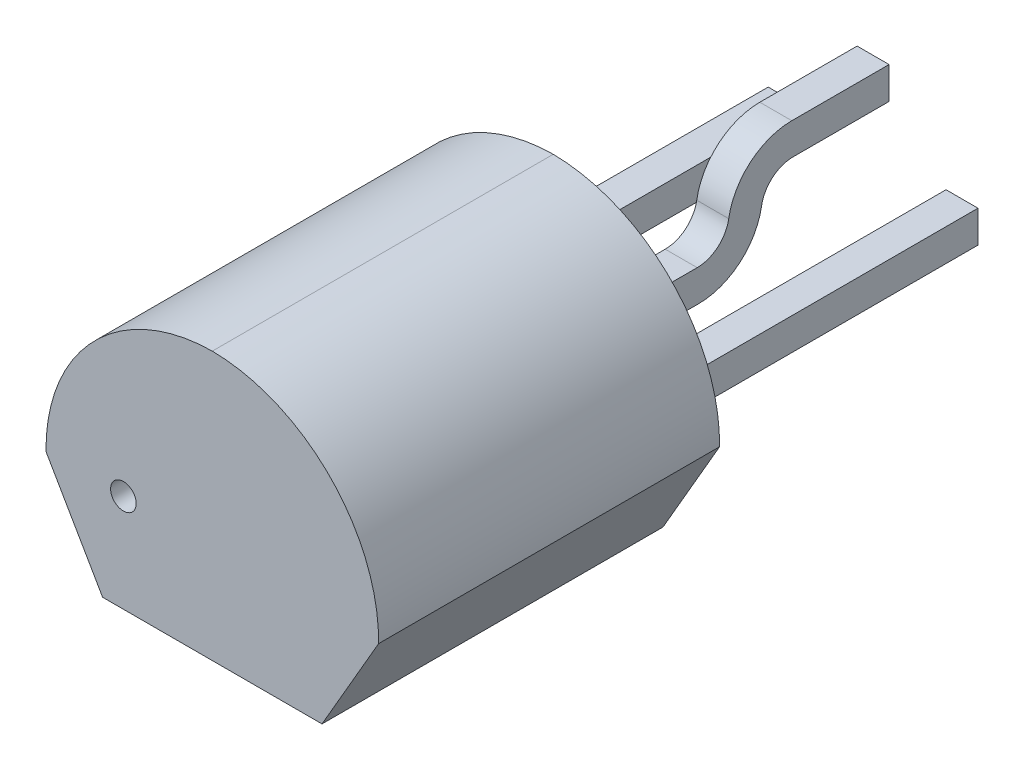
ISO-10303-21;
HEADER;
FILE_DESCRIPTION(('STEP AP214'),'2;1');
FILE_NAME('part.step','',(''),(''),'','','');
FILE_SCHEMA(('AUTOMOTIVE_DESIGN { 1 0 10303 214 1 1 1 1 }'));
ENDSEC;
DATA;
#1=APPLICATION_CONTEXT('core data for automotive mechanical design processes');
#2=APPLICATION_PROTOCOL_DEFINITION('international standard','automotive_design',2000,#1);
#3=PRODUCT_CONTEXT('',#1,'mechanical');
#4=PRODUCT('Part','Part','',(#3));
#5=PRODUCT_RELATED_PRODUCT_CATEGORY('part','',(#4));
#6=PRODUCT_DEFINITION_FORMATION('','',#4);
#7=PRODUCT_DEFINITION_CONTEXT('part definition',#1,'design');
#8=PRODUCT_DEFINITION('design','',#6,#7);
#9=PRODUCT_DEFINITION_SHAPE('','',#8);
#10=(LENGTH_UNIT() NAMED_UNIT(*) SI_UNIT(.MILLI.,.METRE.));
#11=(NAMED_UNIT(*) PLANE_ANGLE_UNIT() SI_UNIT($,.RADIAN.));
#12=(NAMED_UNIT(*) SI_UNIT($,.STERADIAN.) SOLID_ANGLE_UNIT());
#13=UNCERTAINTY_MEASURE_WITH_UNIT(LENGTH_MEASURE(1.E-05),#10,'distance_accuracy_value','');
#14=(GEOMETRIC_REPRESENTATION_CONTEXT(3) GLOBAL_UNCERTAINTY_ASSIGNED_CONTEXT((#13)) GLOBAL_UNIT_ASSIGNED_CONTEXT((#10,
#11,#12)) REPRESENTATION_CONTEXT('',''));
#15=CARTESIAN_POINT('',(0.,0.,0.));
#16=DIRECTION('',(0.,0.,1.));
#17=DIRECTION('',(1.,0.,0.));
#18=AXIS2_PLACEMENT_3D('',#15,#16,#17);
#19=CARTESIAN_POINT('',(1.14,0.25,2.54));
#20=DIRECTION('',(1.,0.,0.));
#21=DIRECTION('',(0.,0.,-1.));
#22=AXIS2_PLACEMENT_3D('',#19,#20,#21);
#23=PLANE('',#22);
#24=CARTESIAN_POINT('',(1.14,0.5,-0.96));
#25=DIRECTION('',(1.,0.,0.));
#26=DIRECTION('',(0.,0.,-1.));
#27=AXIS2_PLACEMENT_3D('',#24,#25,#26);
#28=CIRCLE('',#27,0.5);
#29=CARTESIAN_POINT('',(1.14,0.583333333333334,-0.466993351408365));
#30=VERTEX_POINT('',#29);
#31=CARTESIAN_POINT('',(1.14,1.,-0.960000000000003));
#32=VERTEX_POINT('',#31);
#33=EDGE_CURVE('E238',#30,#32,#28,.F.);
#34=ORIENTED_EDGE('',*,*,#33,.F.);
#35=CARTESIAN_POINT('',(1.14,0.750000000000001,0.519019945774904));
#36=DIRECTION('',(1.,0.,0.));
#37=DIRECTION('',(0.,0.,-1.));
#38=AXIS2_PLACEMENT_3D('',#35,#36,#37);
#39=CIRCLE('',#38,1.);
#40=CARTESIAN_POINT('',(1.14,-0.25,0.519019945774904));
#41=VERTEX_POINT('',#40);
#42=EDGE_CURVE('E52',#30,#41,#39,.F.);
#43=ORIENTED_EDGE('',*,*,#42,.T.);
#44=DIRECTION('',(0.,0.,-1.));
#45=VECTOR('',#44,1.);
#46=CARTESIAN_POINT('',(1.14,-0.25,2.54));
#47=LINE('',#46,#45);
#48=CARTESIAN_POINT('',(1.14,-0.25,2.54));
#49=VERTEX_POINT('',#48);
#50=EDGE_CURVE('E303',#49,#41,#47,.T.);
#51=ORIENTED_EDGE('',*,*,#50,.F.);
#52=DIRECTION('',(0.,-1.,0.));
#53=VECTOR('',#52,1.);
#54=CARTESIAN_POINT('',(1.14,0.25,2.54));
#55=LINE('',#54,#53);
#56=CARTESIAN_POINT('',(1.14,0.25,2.54));
#57=VERTEX_POINT('',#56);
#58=EDGE_CURVE('E283',#57,#49,#55,.T.);
#59=ORIENTED_EDGE('',*,*,#58,.F.);
#60=DIRECTION('',(0.,0.,-1.));
#61=VECTOR('',#60,1.);
#62=CARTESIAN_POINT('',(1.14,0.25,2.54));
#63=LINE('',#62,#61);
#64=CARTESIAN_POINT('',(1.14,0.25,0.54));
#65=VERTEX_POINT('',#64);
#66=EDGE_CURVE('E295',#57,#65,#63,.T.);
#67=ORIENTED_EDGE('',*,*,#66,.T.);
#68=CARTESIAN_POINT('',(1.14,0.75,0.54));
#69=DIRECTION('',(1.,0.,0.));
#70=DIRECTION('',(0.,0.,-1.));
#71=AXIS2_PLACEMENT_3D('',#68,#69,#70);
#72=CIRCLE('',#71,0.5);
#73=CARTESIAN_POINT('',(1.14,0.666666666666667,0.0469933514083655));
#74=VERTEX_POINT('',#73);
#75=EDGE_CURVE('E220',#65,#74,#72,.T.);
#76=ORIENTED_EDGE('',*,*,#75,.T.);
#77=CARTESIAN_POINT('',(1.14,0.5,-0.939019945774904));
#78=DIRECTION('',(1.,0.,0.));
#79=DIRECTION('',(0.,0.,-1.));
#80=AXIS2_PLACEMENT_3D('',#77,#78,#79);
#81=CIRCLE('',#80,1.);
#82=CARTESIAN_POINT('',(1.14,1.5,-0.939019945774904));
#83=VERTEX_POINT('',#82);
#84=EDGE_CURVE('E230',#74,#83,#81,.F.);
#85=ORIENTED_EDGE('',*,*,#84,.T.);
#86=DIRECTION('',(0.,0.,1.));
#87=VECTOR('',#86,1.);
#88=CARTESIAN_POINT('',(1.14,1.5,-10.16));
#89=LINE('',#88,#87);
#90=CARTESIAN_POINT('',(1.14,1.5,-2.46));
#91=VERTEX_POINT('',#90);
#92=EDGE_CURVE('E243',#91,#83,#89,.T.);
#93=ORIENTED_EDGE('',*,*,#92,.F.);
#94=DIRECTION('',(0.,1.,0.));
#95=VECTOR('',#94,1.);
#96=CARTESIAN_POINT('',(1.14,0.25,-2.46));
#97=LINE('',#96,#95);
#98=CARTESIAN_POINT('',(1.14,1.,-2.46));
#99=VERTEX_POINT('',#98);
#100=EDGE_CURVE('E195',#99,#91,#97,.T.);
#101=ORIENTED_EDGE('',*,*,#100,.F.);
#102=DIRECTION('',(0.,0.,-1.));
#103=VECTOR('',#102,1.);
#104=CARTESIAN_POINT('',(1.14,1.,2.54));
#105=LINE('',#104,#103);
#106=EDGE_CURVE('E204',#32,#99,#105,.T.);
#107=ORIENTED_EDGE('',*,*,#106,.F.);
#108=EDGE_LOOP('',(#34,#43,#51,#59,#67,#76,#85,#93,#101,#107));
#109=FACE_BOUND('',#108,.T.);
#110=ADVANCED_FACE('F30',(#109),#23,.F.);
#111=CARTESIAN_POINT('',(1.14,-0.25,2.54));
#112=DIRECTION('',(0.,1.,0.));
#113=DIRECTION('',(-1.,0.,0.));
#114=AXIS2_PLACEMENT_3D('',#111,#112,#113);
#115=PLANE('',#114);
#116=ORIENTED_EDGE('',*,*,#50,.T.);
#117=DIRECTION('',(1.,0.,0.));
#118=VECTOR('',#117,1.);
#119=CARTESIAN_POINT('',(1.64,-0.25,0.519019945774904));
#120=LINE('',#119,#118);
#121=CARTESIAN_POINT('',(1.64,-0.25,0.519019945774904));
#122=VERTEX_POINT('',#121);
#123=EDGE_CURVE('E38',#41,#122,#120,.T.);
#124=ORIENTED_EDGE('',*,*,#123,.T.);
#125=DIRECTION('',(0.,0.,-1.));
#126=VECTOR('',#125,1.);
#127=CARTESIAN_POINT('',(1.64,-0.25,2.54));
#128=LINE('',#127,#126);
#129=CARTESIAN_POINT('',(1.64,-0.25,2.54));
#130=VERTEX_POINT('',#129);
#131=EDGE_CURVE('E301',#130,#122,#128,.T.);
#132=ORIENTED_EDGE('',*,*,#131,.F.);
#133=DIRECTION('',(1.,0.,0.));
#134=VECTOR('',#133,1.);
#135=CARTESIAN_POINT('',(1.14,-0.25,2.54));
#136=LINE('',#135,#134);
#137=EDGE_CURVE('E286',#49,#130,#136,.T.);
#138=ORIENTED_EDGE('',*,*,#137,.F.);
#139=EDGE_LOOP('',(#116,#124,#132,#138));
#140=FACE_BOUND('',#139,.T.);
#141=ADVANCED_FACE('F391',(#140),#115,.F.);
#142=CARTESIAN_POINT('',(1.64,0.25,2.54));
#143=DIRECTION('',(-1.,0.,0.));
#144=DIRECTION('',(0.,0.,1.));
#145=AXIS2_PLACEMENT_3D('',#142,#143,#144);
#146=PLANE('',#145);
#147=ORIENTED_EDGE('',*,*,#131,.T.);
#148=CARTESIAN_POINT('',(1.64,0.750000000000001,0.519019945774904));
#149=DIRECTION('',(-1.,0.,0.));
#150=DIRECTION('',(0.,0.,1.));
#151=AXIS2_PLACEMENT_3D('',#148,#149,#150);
#152=CIRCLE('',#151,1.);
#153=CARTESIAN_POINT('',(1.64,0.583333333333334,-0.466993351408365));
#154=VERTEX_POINT('',#153);
#155=EDGE_CURVE('E11',#122,#154,#152,.F.);
#156=ORIENTED_EDGE('',*,*,#155,.T.);
#157=CARTESIAN_POINT('',(1.64,0.5,-0.96));
#158=DIRECTION('',(-1.,0.,0.));
#159=DIRECTION('',(0.,0.,1.));
#160=AXIS2_PLACEMENT_3D('',#157,#158,#159);
#161=CIRCLE('',#160,0.5);
#162=CARTESIAN_POINT('',(1.64,1.,-0.960000000000003));
#163=VERTEX_POINT('',#162);
#164=EDGE_CURVE('E209',#163,#154,#161,.F.);
#165=ORIENTED_EDGE('',*,*,#164,.F.);
#166=DIRECTION('',(0.,0.,1.));
#167=VECTOR('',#166,1.);
#168=CARTESIAN_POINT('',(1.64,1.,2.54));
#169=LINE('',#168,#167);
#170=CARTESIAN_POINT('',(1.64,1.,-2.46));
#171=VERTEX_POINT('',#170);
#172=EDGE_CURVE('E201',#171,#163,#169,.T.);
#173=ORIENTED_EDGE('',*,*,#172,.F.);
#174=DIRECTION('',(0.,-1.,0.));
#175=VECTOR('',#174,1.);
#176=CARTESIAN_POINT('',(1.64,0.25,-2.46));
#177=LINE('',#176,#175);
#178=CARTESIAN_POINT('',(1.64,1.5,-2.46));
#179=VERTEX_POINT('',#178);
#180=EDGE_CURVE('E185',#179,#171,#177,.T.);
#181=ORIENTED_EDGE('',*,*,#180,.F.);
#182=DIRECTION('',(0.,0.,-1.));
#183=VECTOR('',#182,1.);
#184=CARTESIAN_POINT('',(1.64,1.5,0.0400000000000001));
#185=LINE('',#184,#183);
#186=CARTESIAN_POINT('',(1.64,1.5,-0.939019945774904));
#187=VERTEX_POINT('',#186);
#188=EDGE_CURVE('E251',#187,#179,#185,.T.);
#189=ORIENTED_EDGE('',*,*,#188,.F.);
#190=CARTESIAN_POINT('',(1.64,0.5,-0.939019945774904));
#191=DIRECTION('',(-1.,0.,0.));
#192=DIRECTION('',(0.,0.,1.));
#193=AXIS2_PLACEMENT_3D('',#190,#191,#192);
#194=CIRCLE('',#193,1.);
#195=CARTESIAN_POINT('',(1.64,0.666666666666667,0.0469933514083655));
#196=VERTEX_POINT('',#195);
#197=EDGE_CURVE('E226',#187,#196,#194,.F.);
#198=ORIENTED_EDGE('',*,*,#197,.T.);
#199=CARTESIAN_POINT('',(1.64,0.75,0.54));
#200=DIRECTION('',(-1.,0.,0.));
#201=DIRECTION('',(0.,0.,1.));
#202=AXIS2_PLACEMENT_3D('',#199,#200,#201);
#203=CIRCLE('',#202,0.5);
#204=CARTESIAN_POINT('',(1.64,0.25,0.54));
#205=VERTEX_POINT('',#204);
#206=EDGE_CURVE('E218',#196,#205,#203,.T.);
#207=ORIENTED_EDGE('',*,*,#206,.T.);
#208=DIRECTION('',(0.,0.,-1.));
#209=VECTOR('',#208,1.);
#210=CARTESIAN_POINT('',(1.64,0.25,2.54));
#211=LINE('',#210,#209);
#212=CARTESIAN_POINT('',(1.64,0.25,2.54));
#213=VERTEX_POINT('',#212);
#214=EDGE_CURVE('E298',#213,#205,#211,.T.);
#215=ORIENTED_EDGE('',*,*,#214,.F.);
#216=DIRECTION('',(0.,1.,0.));
#217=VECTOR('',#216,1.);
#218=CARTESIAN_POINT('',(1.64,0.25,2.54));
#219=LINE('',#218,#217);
#220=EDGE_CURVE('E289',#130,#213,#219,.T.);
#221=ORIENTED_EDGE('',*,*,#220,.F.);
#222=EDGE_LOOP('',(#147,#156,#165,#173,#181,#189,#198,#207,#215,#221));
#223=FACE_BOUND('',#222,.T.);
#224=ADVANCED_FACE('F207',(#223),#146,.F.);
#225=CARTESIAN_POINT('',(-0.25,0.25,2.54));
#226=DIRECTION('',(1.,0.,0.));
#227=DIRECTION('',(0.,1.,0.));
#228=AXIS2_PLACEMENT_3D('',#225,#226,#227);
#229=PLANE('',#228);
#230=DIRECTION('',(0.,1.,0.));
#231=VECTOR('',#230,1.);
#232=CARTESIAN_POINT('',(-0.25,0.25,-2.46));
#233=LINE('',#232,#231);
#234=CARTESIAN_POINT('',(-0.25,-0.25,-2.46));
#235=VERTEX_POINT('',#234);
#236=CARTESIAN_POINT('',(-0.25,0.25,-2.46));
#237=VERTEX_POINT('',#236);
#238=EDGE_CURVE('E241',#235,#237,#233,.T.);
#239=ORIENTED_EDGE('',*,*,#238,.F.);
#240=DIRECTION('',(0.,0.,-1.));
#241=VECTOR('',#240,1.);
#242=CARTESIAN_POINT('',(-0.25,-0.25,2.54));
#243=LINE('',#242,#241);
#244=CARTESIAN_POINT('',(-0.25,-0.25,2.54));
#245=VERTEX_POINT('',#244);
#246=EDGE_CURVE('E326',#245,#235,#243,.T.);
#247=ORIENTED_EDGE('',*,*,#246,.F.);
#248=DIRECTION('',(0.,-1.,0.));
#249=VECTOR('',#248,1.);
#250=CARTESIAN_POINT('',(-0.25,0.25,2.54));
#251=LINE('',#250,#249);
#252=CARTESIAN_POINT('',(-0.25,0.25,2.54));
#253=VERTEX_POINT('',#252);
#254=EDGE_CURVE('E305',#253,#245,#251,.T.);
#255=ORIENTED_EDGE('',*,*,#254,.F.);
#256=DIRECTION('',(0.,0.,-1.));
#257=VECTOR('',#256,1.);
#258=CARTESIAN_POINT('',(-0.25,0.25,2.54));
#259=LINE('',#258,#257);
#260=EDGE_CURVE('E317',#253,#237,#259,.T.);
#261=ORIENTED_EDGE('',*,*,#260,.T.);
#262=EDGE_LOOP('',(#239,#247,#255,#261));
#263=FACE_BOUND('',#262,.T.);
#264=ADVANCED_FACE('F411',(#263),#229,.F.);
#265=CARTESIAN_POINT('',(-0.25,-0.25,2.54));
#266=DIRECTION('',(0.,1.,0.));
#267=DIRECTION('',(0.,0.,1.));
#268=AXIS2_PLACEMENT_3D('',#265,#266,#267);
#269=PLANE('',#268);
#270=DIRECTION('',(-1.,0.,0.));
#271=VECTOR('',#270,1.);
#272=CARTESIAN_POINT('',(-0.25,-0.25,-2.46));
#273=LINE('',#272,#271);
#274=CARTESIAN_POINT('',(0.25,-0.25,-2.46));
#275=VERTEX_POINT('',#274);
#276=EDGE_CURVE('E245',#275,#235,#273,.T.);
#277=ORIENTED_EDGE('',*,*,#276,.F.);
#278=DIRECTION('',(0.,0.,-1.));
#279=VECTOR('',#278,1.);
#280=CARTESIAN_POINT('',(0.25,-0.25,2.54));
#281=LINE('',#280,#279);
#282=CARTESIAN_POINT('',(0.25,-0.25,2.54));
#283=VERTEX_POINT('',#282);
#284=EDGE_CURVE('E323',#283,#275,#281,.T.);
#285=ORIENTED_EDGE('',*,*,#284,.F.);
#286=DIRECTION('',(1.,0.,0.));
#287=VECTOR('',#286,1.);
#288=CARTESIAN_POINT('',(-0.25,-0.25,2.54));
#289=LINE('',#288,#287);
#290=EDGE_CURVE('E308',#245,#283,#289,.T.);
#291=ORIENTED_EDGE('',*,*,#290,.F.);
#292=ORIENTED_EDGE('',*,*,#246,.T.);
#293=EDGE_LOOP('',(#277,#285,#291,#292));
#294=FACE_BOUND('',#293,.T.);
#295=ADVANCED_FACE('F407',(#294),#269,.F.);
#296=CARTESIAN_POINT('',(0.25,0.25,2.54));
#297=DIRECTION('',(-1.,0.,0.));
#298=DIRECTION('',(0.,-1.,0.));
#299=AXIS2_PLACEMENT_3D('',#296,#297,#298);
#300=PLANE('',#299);
#301=DIRECTION('',(0.,-1.,0.));
#302=VECTOR('',#301,1.);
#303=CARTESIAN_POINT('',(0.25,0.25,-2.46));
#304=LINE('',#303,#302);
#305=CARTESIAN_POINT('',(0.25,0.25,-2.46));
#306=VERTEX_POINT('',#305);
#307=EDGE_CURVE('E721',#306,#275,#304,.T.);
#308=ORIENTED_EDGE('',*,*,#307,.F.);
#309=DIRECTION('',(0.,0.,-1.));
#310=VECTOR('',#309,1.);
#311=CARTESIAN_POINT('',(0.25,0.25,2.54));
#312=LINE('',#311,#310);
#313=CARTESIAN_POINT('',(0.25,0.25,2.54));
#314=VERTEX_POINT('',#313);
#315=EDGE_CURVE('E320',#314,#306,#312,.T.);
#316=ORIENTED_EDGE('',*,*,#315,.F.);
#317=DIRECTION('',(0.,1.,0.));
#318=VECTOR('',#317,1.);
#319=CARTESIAN_POINT('',(0.25,0.25,2.54));
#320=LINE('',#319,#318);
#321=EDGE_CURVE('E311',#283,#314,#320,.T.);
#322=ORIENTED_EDGE('',*,*,#321,.F.);
#323=ORIENTED_EDGE('',*,*,#284,.T.);
#324=EDGE_LOOP('',(#308,#316,#322,#323));
#325=FACE_BOUND('',#324,.T.);
#326=ADVANCED_FACE('F403',(#325),#300,.F.);
#327=CARTESIAN_POINT('',(-0.25,0.25,2.54));
#328=DIRECTION('',(0.,-1.,0.));
#329=DIRECTION('',(0.,0.,-1.));
#330=AXIS2_PLACEMENT_3D('',#327,#328,#329);
#331=PLANE('',#330);
#332=DIRECTION('',(1.,0.,0.));
#333=VECTOR('',#332,1.);
#334=CARTESIAN_POINT('',(-0.25,0.25,-2.46));
#335=LINE('',#334,#333);
#336=EDGE_CURVE('E707',#237,#306,#335,.T.);
#337=ORIENTED_EDGE('',*,*,#336,.F.);
#338=ORIENTED_EDGE('',*,*,#260,.F.);
#339=DIRECTION('',(-1.,0.,0.));
#340=VECTOR('',#339,1.);
#341=CARTESIAN_POINT('',(-0.25,0.25,2.54));
#342=LINE('',#341,#340);
#343=EDGE_CURVE('E314',#314,#253,#342,.T.);
#344=ORIENTED_EDGE('',*,*,#343,.F.);
#345=ORIENTED_EDGE('',*,*,#315,.T.);
#346=EDGE_LOOP('',(#337,#338,#344,#345));
#347=FACE_BOUND('',#346,.T.);
#348=ADVANCED_FACE('F399',(#347),#331,.F.);
#349=CARTESIAN_POINT('',(2.53,0.25,2.54));
#350=DIRECTION('',(1.,0.,0.));
#351=DIRECTION('',(0.,0.,-1.));
#352=AXIS2_PLACEMENT_3D('',#349,#350,#351);
#353=PLANE('',#352);
#354=DIRECTION('',(0.,1.,0.));
#355=VECTOR('',#354,1.);
#356=CARTESIAN_POINT('',(2.53,0.25,-2.46));
#357=LINE('',#356,#355);
#358=CARTESIAN_POINT('',(2.53,-0.25,-2.46));
#359=VERTEX_POINT('',#358);
#360=CARTESIAN_POINT('',(2.53,0.25,-2.46));
#361=VERTEX_POINT('',#360);
#362=EDGE_CURVE('E704',#359,#361,#357,.T.);
#363=ORIENTED_EDGE('',*,*,#362,.F.);
#364=DIRECTION('',(0.,0.,-1.));
#365=VECTOR('',#364,1.);
#366=CARTESIAN_POINT('',(2.53,-0.25,2.54));
#367=LINE('',#366,#365);
#368=CARTESIAN_POINT('',(2.53,-0.25,2.54));
#369=VERTEX_POINT('',#368);
#370=EDGE_CURVE('E280',#369,#359,#367,.T.);
#371=ORIENTED_EDGE('',*,*,#370,.F.);
#372=DIRECTION('',(0.,-1.,0.));
#373=VECTOR('',#372,1.);
#374=CARTESIAN_POINT('',(2.53,0.25,2.54));
#375=LINE('',#374,#373);
#376=CARTESIAN_POINT('',(2.53,0.25,2.54));
#377=VERTEX_POINT('',#376);
#378=EDGE_CURVE('E257',#377,#369,#375,.T.);
#379=ORIENTED_EDGE('',*,*,#378,.F.);
#380=DIRECTION('',(0.,0.,-1.));
#381=VECTOR('',#380,1.);
#382=CARTESIAN_POINT('',(2.53,0.25,2.54));
#383=LINE('',#382,#381);
#384=EDGE_CURVE('E271',#377,#361,#383,.T.);
#385=ORIENTED_EDGE('',*,*,#384,.T.);
#386=EDGE_LOOP('',(#363,#371,#379,#385));
#387=FACE_BOUND('',#386,.T.);
#388=ADVANCED_FACE('F402',(#387),#353,.F.);
#389=CARTESIAN_POINT('',(2.53,-0.25,2.54));
#390=DIRECTION('',(0.,1.,0.));
#391=DIRECTION('',(-1.,0.,0.));
#392=AXIS2_PLACEMENT_3D('',#389,#390,#391);
#393=PLANE('',#392);
#394=DIRECTION('',(-1.,0.,0.));
#395=VECTOR('',#394,1.);
#396=CARTESIAN_POINT('',(2.53,-0.25,-2.46));
#397=LINE('',#396,#395);
#398=CARTESIAN_POINT('',(3.03,-0.25,-2.46));
#399=VERTEX_POINT('',#398);
#400=EDGE_CURVE('E708',#399,#359,#397,.T.);
#401=ORIENTED_EDGE('',*,*,#400,.F.);
#402=DIRECTION('',(0.,0.,-1.));
#403=VECTOR('',#402,1.);
#404=CARTESIAN_POINT('',(3.03,-0.25,2.54));
#405=LINE('',#404,#403);
#406=CARTESIAN_POINT('',(3.03,-0.25,2.54));
#407=VERTEX_POINT('',#406);
#408=EDGE_CURVE('E277',#407,#399,#405,.T.);
#409=ORIENTED_EDGE('',*,*,#408,.F.);
#410=DIRECTION('',(1.,0.,0.));
#411=VECTOR('',#410,1.);
#412=CARTESIAN_POINT('',(2.53,-0.25,2.54));
#413=LINE('',#412,#411);
#414=EDGE_CURVE('E262',#369,#407,#413,.T.);
#415=ORIENTED_EDGE('',*,*,#414,.F.);
#416=ORIENTED_EDGE('',*,*,#370,.T.);
#417=EDGE_LOOP('',(#401,#409,#415,#416));
#418=FACE_BOUND('',#417,.T.);
#419=ADVANCED_FACE('F477',(#418),#393,.F.);
#420=CARTESIAN_POINT('',(3.03,0.25,2.54));
#421=DIRECTION('',(-1.,0.,0.));
#422=DIRECTION('',(0.,-1.,0.));
#423=AXIS2_PLACEMENT_3D('',#420,#421,#422);
#424=PLANE('',#423);
#425=DIRECTION('',(0.,-1.,0.));
#426=VECTOR('',#425,1.);
#427=CARTESIAN_POINT('',(3.03,0.25,-2.46));
#428=LINE('',#427,#426);
#429=CARTESIAN_POINT('',(3.03,0.25,-2.46));
#430=VERTEX_POINT('',#429);
#431=EDGE_CURVE('E715',#430,#399,#428,.T.);
#432=ORIENTED_EDGE('',*,*,#431,.F.);
#433=DIRECTION('',(0.,0.,-1.));
#434=VECTOR('',#433,1.);
#435=CARTESIAN_POINT('',(3.03,0.25,2.54));
#436=LINE('',#435,#434);
#437=CARTESIAN_POINT('',(3.03,0.25,2.54));
#438=VERTEX_POINT('',#437);
#439=EDGE_CURVE('E274',#438,#430,#436,.T.);
#440=ORIENTED_EDGE('',*,*,#439,.F.);
#441=DIRECTION('',(0.,1.,0.));
#442=VECTOR('',#441,1.);
#443=CARTESIAN_POINT('',(3.03,0.25,2.54));
#444=LINE('',#443,#442);
#445=EDGE_CURVE('E265',#407,#438,#444,.T.);
#446=ORIENTED_EDGE('',*,*,#445,.F.);
#447=ORIENTED_EDGE('',*,*,#408,.T.);
#448=EDGE_LOOP('',(#432,#440,#446,#447));
#449=FACE_BOUND('',#448,.T.);
#450=ADVANCED_FACE('F473',(#449),#424,.F.);
#451=CARTESIAN_POINT('',(2.53,0.25,2.54));
#452=DIRECTION('',(0.,-1.,0.));
#453=DIRECTION('',(1.,0.,0.));
#454=AXIS2_PLACEMENT_3D('',#451,#452,#453);
#455=PLANE('',#454);
#456=DIRECTION('',(1.,0.,0.));
#457=VECTOR('',#456,1.);
#458=CARTESIAN_POINT('',(2.53,0.25,-2.46));
#459=LINE('',#458,#457);
#460=EDGE_CURVE('E210',#361,#430,#459,.T.);
#461=ORIENTED_EDGE('',*,*,#460,.F.);
#462=ORIENTED_EDGE('',*,*,#384,.F.);
#463=DIRECTION('',(-1.,0.,0.));
#464=VECTOR('',#463,1.);
#465=CARTESIAN_POINT('',(2.53,0.25,2.54));
#466=LINE('',#465,#464);
#467=EDGE_CURVE('E268',#438,#377,#466,.T.);
#468=ORIENTED_EDGE('',*,*,#467,.F.);
#469=ORIENTED_EDGE('',*,*,#439,.T.);
#470=EDGE_LOOP('',(#461,#462,#468,#469));
#471=FACE_BOUND('',#470,.T.);
#472=ADVANCED_FACE('F463',(#471),#455,.F.);
#473=CARTESIAN_POINT('',(1.14,1.5,-10.16));
#474=DIRECTION('',(0.,1.,0.));
#475=DIRECTION('',(-1.,0.,0.));
#476=AXIS2_PLACEMENT_3D('',#473,#474,#475);
#477=PLANE('',#476);
#478=ORIENTED_EDGE('',*,*,#92,.T.);
#479=DIRECTION('',(1.,0.,0.));
#480=VECTOR('',#479,1.);
#481=CARTESIAN_POINT('',(1.64,1.5,-0.939019945774904));
#482=LINE('',#481,#480);
#483=EDGE_CURVE('E223',#83,#187,#482,.T.);
#484=ORIENTED_EDGE('',*,*,#483,.T.);
#485=ORIENTED_EDGE('',*,*,#188,.T.);
#486=DIRECTION('',(-1.,0.,0.));
#487=VECTOR('',#486,1.);
#488=CARTESIAN_POINT('',(1.14,1.5,-2.46));
#489=LINE('',#488,#487);
#490=EDGE_CURVE('E191',#179,#91,#489,.T.);
#491=ORIENTED_EDGE('',*,*,#490,.T.);
#492=EDGE_LOOP('',(#478,#484,#485,#491));
#493=FACE_BOUND('',#492,.T.);
#494=ADVANCED_FACE('F367',(#493),#477,.T.);
#495=CARTESIAN_POINT('',(1.14,0.25,2.54));
#496=DIRECTION('',(0.,-1.,0.));
#497=DIRECTION('',(1.,0.,0.));
#498=AXIS2_PLACEMENT_3D('',#495,#496,#497);
#499=PLANE('',#498);
#500=ORIENTED_EDGE('',*,*,#214,.T.);
#501=DIRECTION('',(1.,0.,0.));
#502=VECTOR('',#501,1.);
#503=CARTESIAN_POINT('',(1.14,0.25,0.54));
#504=LINE('',#503,#502);
#505=EDGE_CURVE('E212',#205,#65,#504,.F.);
#506=ORIENTED_EDGE('',*,*,#505,.T.);
#507=ORIENTED_EDGE('',*,*,#66,.F.);
#508=DIRECTION('',(-1.,0.,0.));
#509=VECTOR('',#508,1.);
#510=CARTESIAN_POINT('',(1.14,0.25,2.54));
#511=LINE('',#510,#509);
#512=EDGE_CURVE('E292',#213,#57,#511,.T.);
#513=ORIENTED_EDGE('',*,*,#512,.F.);
#514=EDGE_LOOP('',(#500,#506,#507,#513));
#515=FACE_BOUND('',#514,.T.);
#516=ADVANCED_FACE('F380',(#515),#499,.F.);
#517=CARTESIAN_POINT('',(1.36000000000001,0.0299999999999823,2.54));
#518=DIRECTION('',(0.,0.,-1.));
#519=DIRECTION('',(-1.,0.,0.));
#520=AXIS2_PLACEMENT_3D('',#517,#518,#519);
#521=PLANE('',#520);
#522=ORIENTED_EDGE('',*,*,#512,.T.);
#523=ORIENTED_EDGE('',*,*,#58,.T.);
#524=ORIENTED_EDGE('',*,*,#137,.T.);
#525=ORIENTED_EDGE('',*,*,#220,.T.);
#526=EDGE_LOOP('',(#522,#523,#524,#525));
#527=FACE_BOUND('',#526,.T.);
#528=DIRECTION('',(0.500701704226237,-0.865619895441956,0.));
#529=VECTOR('',#528,1.);
#530=CARTESIAN_POINT('',(-1.21000000000002,0.,2.54));
#531=LINE('',#530,#529);
#532=CARTESIAN_POINT('',(-1.21000000000002,0.,2.54));
#533=VERTEX_POINT('',#532);
#534=CARTESIAN_POINT('',(-0.325,-1.53000000000002,2.54));
#535=VERTEX_POINT('',#534);
#536=EDGE_CURVE('E329',#533,#535,#531,.T.);
#537=ORIENTED_EDGE('',*,*,#536,.F.);
#538=CARTESIAN_POINT('',(1.41999999999998,0.0299999999999944,2.54));
#539=DIRECTION('',(0.,0.,1.));
#540=DIRECTION('',(-1.,0.,0.));
#541=AXIS2_PLACEMENT_3D('',#538,#539,#540);
#542=CIRCLE('',#541,2.63017109709616);
#543=CARTESIAN_POINT('',(1.38999999999999,2.66,2.54));
#544=VERTEX_POINT('',#543);
#545=EDGE_CURVE('E334',#544,#533,#542,.T.);
#546=ORIENTED_EDGE('',*,*,#545,.F.);
#547=CARTESIAN_POINT('',(1.36000000000001,0.0299999999999823,2.54));
#548=DIRECTION('',(0.,0.,1.));
#549=DIRECTION('',(-1.,0.,0.));
#550=AXIS2_PLACEMENT_3D('',#547,#548,#549);
#551=CIRCLE('',#550,2.63017109709617);
#552=CARTESIAN_POINT('',(3.99000000000002,0.,2.54));
#553=VERTEX_POINT('',#552);
#554=EDGE_CURVE('E349',#553,#544,#551,.T.);
#555=ORIENTED_EDGE('',*,*,#554,.F.);
#556=DIRECTION('',(0.500701704226238,0.865619895441955,0.));
#557=VECTOR('',#556,1.);
#558=CARTESIAN_POINT('',(3.99000000000002,0.,2.54));
#559=LINE('',#558,#557);
#560=CARTESIAN_POINT('',(3.105,-1.53000000000001,2.54));
#561=VERTEX_POINT('',#560);
#562=EDGE_CURVE('E347',#561,#553,#559,.T.);
#563=ORIENTED_EDGE('',*,*,#562,.F.);
#564=DIRECTION('',(1.,0.,0.));
#565=VECTOR('',#564,1.);
#566=CARTESIAN_POINT('',(-0.325,-1.53000000000002,2.54));
#567=LINE('',#566,#565);
#568=EDGE_CURVE('E345',#535,#561,#567,.T.);
#569=ORIENTED_EDGE('',*,*,#568,.F.);
#570=EDGE_LOOP('',(#537,#546,#555,#563,#569));
#571=FACE_BOUND('',#570,.T.);
#572=ORIENTED_EDGE('',*,*,#343,.T.);
#573=ORIENTED_EDGE('',*,*,#254,.T.);
#574=ORIENTED_EDGE('',*,*,#290,.T.);
#575=ORIENTED_EDGE('',*,*,#321,.T.);
#576=EDGE_LOOP('',(#572,#573,#574,#575));
#577=FACE_BOUND('',#576,.T.);
#578=ORIENTED_EDGE('',*,*,#467,.T.);
#579=ORIENTED_EDGE('',*,*,#378,.T.);
#580=ORIENTED_EDGE('',*,*,#414,.T.);
#581=ORIENTED_EDGE('',*,*,#445,.T.);
#582=EDGE_LOOP('',(#578,#579,#580,#581));
#583=FACE_BOUND('',#582,.T.);
#584=ADVANCED_FACE('F383',(#527,#571,#577,#583),#521,.T.);
#585=CARTESIAN_POINT('',(-1.21000000000002,0.,7.87));
#586=DIRECTION('',(0.865619895441956,0.500701704226236,0.));
#587=DIRECTION('',(-0.500701704226237,0.865619895441956,0.));
#588=AXIS2_PLACEMENT_3D('',#585,#586,#587);
#589=PLANE('',#588);
#590=ORIENTED_EDGE('',*,*,#536,.T.);
#591=DIRECTION('',(0.,0.,-1.));
#592=VECTOR('',#591,1.);
#593=CARTESIAN_POINT('',(-0.325,-1.53000000000002,7.87));
#594=LINE('',#593,#592);
#595=CARTESIAN_POINT('',(-0.325,-1.53000000000002,7.87));
#596=VERTEX_POINT('',#595);
#597=EDGE_CURVE('E363',#596,#535,#594,.T.);
#598=ORIENTED_EDGE('',*,*,#597,.F.);
#599=DIRECTION('',(0.500701704226237,-0.865619895441956,0.));
#600=VECTOR('',#599,1.);
#601=CARTESIAN_POINT('',(-1.21000000000002,0.,7.87));
#602=LINE('',#601,#600);
#603=CARTESIAN_POINT('',(-1.21000000000002,0.,7.87));
#604=VERTEX_POINT('',#603);
#605=EDGE_CURVE('E330',#604,#596,#602,.T.);
#606=ORIENTED_EDGE('',*,*,#605,.F.);
#607=DIRECTION('',(0.,0.,-1.));
#608=VECTOR('',#607,1.);
#609=CARTESIAN_POINT('',(-1.21000000000002,0.,7.87));
#610=LINE('',#609,#608);
#611=EDGE_CURVE('E342',#604,#533,#610,.T.);
#612=ORIENTED_EDGE('',*,*,#611,.T.);
#613=EDGE_LOOP('',(#590,#598,#606,#612));
#614=FACE_BOUND('',#613,.T.);
#615=ADVANCED_FACE('F424',(#614),#589,.F.);
#616=CARTESIAN_POINT('',(-0.325,-1.53000000000002,7.87));
#617=DIRECTION('',(0.,1.,0.));
#618=DIRECTION('',(-1.,0.,0.));
#619=AXIS2_PLACEMENT_3D('',#616,#617,#618);
#620=PLANE('',#619);
#621=ORIENTED_EDGE('',*,*,#568,.T.);
#622=DIRECTION('',(0.,0.,-1.));
#623=VECTOR('',#622,1.);
#624=CARTESIAN_POINT('',(3.105,-1.53000000000001,7.87));
#625=LINE('',#624,#623);
#626=CARTESIAN_POINT('',(3.105,-1.53000000000001,7.87));
#627=VERTEX_POINT('',#626);
#628=EDGE_CURVE('E360',#627,#561,#625,.T.);
#629=ORIENTED_EDGE('',*,*,#628,.F.);
#630=DIRECTION('',(1.,0.,0.));
#631=VECTOR('',#630,1.);
#632=CARTESIAN_POINT('',(-0.325,-1.53000000000002,7.87));
#633=LINE('',#632,#631);
#634=EDGE_CURVE('E333',#596,#627,#633,.T.);
#635=ORIENTED_EDGE('',*,*,#634,.F.);
#636=ORIENTED_EDGE('',*,*,#597,.T.);
#637=EDGE_LOOP('',(#621,#629,#635,#636));
#638=FACE_BOUND('',#637,.T.);
#639=ADVANCED_FACE('F435',(#638),#620,.F.);
#640=CARTESIAN_POINT('',(3.99000000000002,0.,7.87));
#641=DIRECTION('',(-0.865619895441955,0.500701704226238,0.));
#642=DIRECTION('',(-0.500701704226238,-0.865619895441955,0.));
#643=AXIS2_PLACEMENT_3D('',#640,#641,#642);
#644=PLANE('',#643);
#645=ORIENTED_EDGE('',*,*,#562,.T.);
#646=DIRECTION('',(0.,0.,-1.));
#647=VECTOR('',#646,1.);
#648=CARTESIAN_POINT('',(3.99000000000002,0.,7.87));
#649=LINE('',#648,#647);
#650=CARTESIAN_POINT('',(3.99000000000002,0.,7.87));
#651=VERTEX_POINT('',#650);
#652=EDGE_CURVE('E357',#651,#553,#649,.T.);
#653=ORIENTED_EDGE('',*,*,#652,.F.);
#654=DIRECTION('',(0.500701704226238,0.865619895441955,0.));
#655=VECTOR('',#654,1.);
#656=CARTESIAN_POINT('',(3.99000000000002,0.,7.87));
#657=LINE('',#656,#655);
#658=EDGE_CURVE('E336',#627,#651,#657,.T.);
#659=ORIENTED_EDGE('',*,*,#658,.F.);
#660=ORIENTED_EDGE('',*,*,#628,.T.);
#661=EDGE_LOOP('',(#645,#653,#659,#660));
#662=FACE_BOUND('',#661,.T.);
#663=ADVANCED_FACE('F431',(#662),#644,.F.);
#664=CARTESIAN_POINT('',(1.36000000000001,0.0299999999999823,7.87));
#665=DIRECTION('',(0.,0.,-1.));
#666=DIRECTION('',(-1.,0.,0.));
#667=AXIS2_PLACEMENT_3D('',#664,#665,#666);
#668=CYLINDRICAL_SURFACE('',#667,2.63017109709617);
#669=ORIENTED_EDGE('',*,*,#554,.T.);
#670=DIRECTION('',(0.,0.,-1.));
#671=VECTOR('',#670,1.);
#672=CARTESIAN_POINT('',(1.38999999999999,2.66,7.87));
#673=LINE('',#672,#671);
#674=CARTESIAN_POINT('',(1.38999999999999,2.66,7.87));
#675=VERTEX_POINT('',#674);
#676=EDGE_CURVE('E354',#675,#544,#673,.T.);
#677=ORIENTED_EDGE('',*,*,#676,.F.);
#678=CARTESIAN_POINT('',(1.36000000000001,0.0299999999999823,7.87));
#679=DIRECTION('',(0.,0.,1.));
#680=DIRECTION('',(-1.,0.,0.));
#681=AXIS2_PLACEMENT_3D('',#678,#679,#680);
#682=CIRCLE('',#681,2.63017109709617);
#683=EDGE_CURVE('E338',#651,#675,#682,.T.);
#684=ORIENTED_EDGE('',*,*,#683,.F.);
#685=ORIENTED_EDGE('',*,*,#652,.T.);
#686=EDGE_LOOP('',(#669,#677,#684,#685));
#687=FACE_BOUND('',#686,.T.);
#688=ADVANCED_FACE('F427',(#687),#668,.T.);
#689=CARTESIAN_POINT('',(1.41999999999998,0.0299999999999944,7.87));
#690=DIRECTION('',(0.,0.,-1.));
#691=DIRECTION('',(-1.,0.,0.));
#692=AXIS2_PLACEMENT_3D('',#689,#690,#691);
#693=CYLINDRICAL_SURFACE('',#692,2.63017109709616);
#694=ORIENTED_EDGE('',*,*,#545,.T.);
#695=ORIENTED_EDGE('',*,*,#611,.F.);
#696=CARTESIAN_POINT('',(1.41999999999998,0.0299999999999944,7.87));
#697=DIRECTION('',(0.,0.,1.));
#698=DIRECTION('',(-1.,0.,0.));
#699=AXIS2_PLACEMENT_3D('',#696,#697,#698);
#700=CIRCLE('',#699,2.63017109709616);
#701=EDGE_CURVE('E340',#675,#604,#700,.T.);
#702=ORIENTED_EDGE('',*,*,#701,.F.);
#703=ORIENTED_EDGE('',*,*,#676,.T.);
#704=EDGE_LOOP('',(#694,#695,#702,#703));
#705=FACE_BOUND('',#704,.T.);
#706=ADVANCED_FACE('F420',(#705),#693,.T.);
#707=CARTESIAN_POINT('',(1.36000000000001,0.0299999999999823,7.87));
#708=DIRECTION('',(0.,0.,-1.));
#709=DIRECTION('',(-1.,0.,0.));
#710=AXIS2_PLACEMENT_3D('',#707,#708,#709);
#711=PLANE('',#710);
#712=CARTESIAN_POINT('',(0.,0.,7.87));
#713=DIRECTION('',(0.,0.,1.));
#714=DIRECTION('',(1.,0.,0.));
#715=AXIS2_PLACEMENT_3D('',#712,#713,#714);
#716=CIRCLE('',#715,0.2);
#717=CARTESIAN_POINT('',(0.2,0.,7.87));
#718=VERTEX_POINT('',#717);
#719=EDGE_CURVE('E253',#718,#718,#716,.T.);
#720=ORIENTED_EDGE('',*,*,#719,.F.);
#721=EDGE_LOOP('',(#720));
#722=FACE_BOUND('',#721,.T.);
#723=ORIENTED_EDGE('',*,*,#605,.T.);
#724=ORIENTED_EDGE('',*,*,#634,.T.);
#725=ORIENTED_EDGE('',*,*,#658,.T.);
#726=ORIENTED_EDGE('',*,*,#683,.T.);
#727=ORIENTED_EDGE('',*,*,#701,.T.);
#728=EDGE_LOOP('',(#723,#724,#725,#726,#727));
#729=FACE_BOUND('',#728,.T.);
#730=ADVANCED_FACE('F416',(#722,#729),#711,.F.);
#731=CARTESIAN_POINT('',(0.,0.,7.37));
#732=DIRECTION('',(0.,0.,1.));
#733=DIRECTION('',(1.,0.,0.));
#734=AXIS2_PLACEMENT_3D('',#731,#732,#733);
#735=CYLINDRICAL_SURFACE('',#734,0.2);
#736=CARTESIAN_POINT('',(0.,0.,7.37));
#737=DIRECTION('',(0.,0.,1.));
#738=DIRECTION('',(1.,0.,0.));
#739=AXIS2_PLACEMENT_3D('',#736,#737,#738);
#740=CIRCLE('',#739,0.2);
#741=CARTESIAN_POINT('',(0.2,0.,7.37));
#742=VERTEX_POINT('',#741);
#743=EDGE_CURVE('E254',#742,#742,#740,.T.);
#744=ORIENTED_EDGE('',*,*,#743,.F.);
#745=EDGE_LOOP('',(#744));
#746=FACE_BOUND('',#745,.T.);
#747=ORIENTED_EDGE('',*,*,#719,.T.);
#748=EDGE_LOOP('',(#747));
#749=FACE_BOUND('',#748,.T.);
#750=ADVANCED_FACE('F419',(#746,#749),#735,.F.);
#751=CARTESIAN_POINT('',(0.,0.,7.37));
#752=DIRECTION('',(0.,0.,1.));
#753=DIRECTION('',(1.,0.,0.));
#754=AXIS2_PLACEMENT_3D('',#751,#752,#753);
#755=PLANE('',#754);
#756=ORIENTED_EDGE('',*,*,#743,.T.);
#757=EDGE_LOOP('',(#756));
#758=FACE_BOUND('',#757,.T.);
#759=ADVANCED_FACE('F464',(#758),#755,.T.);
#760=CARTESIAN_POINT('',(11.64,1.,-2.46));
#761=DIRECTION('',(0.,0.,-1.));
#762=DIRECTION('',(-1.,0.,0.));
#763=AXIS2_PLACEMENT_3D('',#760,#761,#762);
#764=PLANE('',#763);
#765=ORIENTED_EDGE('',*,*,#100,.T.);
#766=ORIENTED_EDGE('',*,*,#490,.F.);
#767=ORIENTED_EDGE('',*,*,#180,.T.);
#768=DIRECTION('',(-1.,0.,0.));
#769=VECTOR('',#768,1.);
#770=CARTESIAN_POINT('',(11.64,1.,-2.46));
#771=LINE('',#770,#769);
#772=EDGE_CURVE('E188',#171,#99,#771,.T.);
#773=ORIENTED_EDGE('',*,*,#772,.T.);
#774=EDGE_LOOP('',(#765,#766,#767,#773));
#775=FACE_BOUND('',#774,.T.);
#776=ADVANCED_FACE('F187',(#775),#764,.T.);
#777=CARTESIAN_POINT('',(11.64,0.5,-0.96));
#778=DIRECTION('',(-1.,0.,0.));
#779=DIRECTION('',(0.,0.,1.));
#780=AXIS2_PLACEMENT_3D('',#777,#778,#779);
#781=CYLINDRICAL_SURFACE('',#780,0.5);
#782=ORIENTED_EDGE('',*,*,#164,.T.);
#783=DIRECTION('',(-1.,0.,0.));
#784=VECTOR('',#783,1.);
#785=CARTESIAN_POINT('',(11.64,0.583333333333334,-0.466993351408365));
#786=LINE('',#785,#784);
#787=EDGE_CURVE('E232',#154,#30,#786,.T.);
#788=ORIENTED_EDGE('',*,*,#787,.T.);
#789=ORIENTED_EDGE('',*,*,#33,.T.);
#790=DIRECTION('',(-1.,0.,0.));
#791=VECTOR('',#790,1.);
#792=CARTESIAN_POINT('',(11.64,1.,-0.960000000000003));
#793=LINE('',#792,#791);
#794=EDGE_CURVE('E196',#163,#32,#793,.T.);
#795=ORIENTED_EDGE('',*,*,#794,.F.);
#796=EDGE_LOOP('',(#782,#788,#789,#795));
#797=FACE_BOUND('',#796,.T.);
#798=ADVANCED_FACE('F237',(#797),#781,.F.);
#799=CARTESIAN_POINT('',(11.64,1.,-0.960000000000003));
#800=DIRECTION('',(0.,-1.,0.));
#801=DIRECTION('',(0.,0.,-1.));
#802=AXIS2_PLACEMENT_3D('',#799,#800,#801);
#803=PLANE('',#802);
#804=ORIENTED_EDGE('',*,*,#106,.T.);
#805=ORIENTED_EDGE('',*,*,#772,.F.);
#806=ORIENTED_EDGE('',*,*,#172,.T.);
#807=ORIENTED_EDGE('',*,*,#794,.T.);
#808=EDGE_LOOP('',(#804,#805,#806,#807));
#809=FACE_BOUND('',#808,.T.);
#810=ADVANCED_FACE('F199',(#809),#803,.T.);
#811=CARTESIAN_POINT('',(11.64,0.5,-2.46));
#812=DIRECTION('',(0.,0.,-1.));
#813=DIRECTION('',(-1.,0.,0.));
#814=AXIS2_PLACEMENT_3D('',#811,#812,#813);
#815=PLANE('',#814);
#816=ORIENTED_EDGE('',*,*,#362,.T.);
#817=ORIENTED_EDGE('',*,*,#460,.T.);
#818=ORIENTED_EDGE('',*,*,#431,.T.);
#819=ORIENTED_EDGE('',*,*,#400,.T.);
#820=EDGE_LOOP('',(#816,#817,#818,#819));
#821=FACE_BOUND('',#820,.T.);
#822=ADVANCED_FACE('F448',(#821),#815,.T.);
#823=ORIENTED_EDGE('',*,*,#238,.T.);
#824=ORIENTED_EDGE('',*,*,#336,.T.);
#825=ORIENTED_EDGE('',*,*,#307,.T.);
#826=ORIENTED_EDGE('',*,*,#276,.T.);
#827=EDGE_LOOP('',(#823,#824,#825,#826));
#828=FACE_BOUND('',#827,.T.);
#829=ADVANCED_FACE('F444',(#828),#815,.T.);
#830=CARTESIAN_POINT('',(1.14,0.75,0.54));
#831=DIRECTION('',(-1.,0.,0.));
#832=DIRECTION('',(0.,-1.,0.));
#833=AXIS2_PLACEMENT_3D('',#830,#831,#832);
#834=CYLINDRICAL_SURFACE('',#833,0.5);
#835=ORIENTED_EDGE('',*,*,#206,.F.);
#836=DIRECTION('',(-1.,0.,0.));
#837=VECTOR('',#836,1.);
#838=CARTESIAN_POINT('',(1.14,0.666666666666667,0.0469933514083654));
#839=LINE('',#838,#837);
#840=EDGE_CURVE('E228',#196,#74,#839,.T.);
#841=ORIENTED_EDGE('',*,*,#840,.T.);
#842=ORIENTED_EDGE('',*,*,#75,.F.);
#843=ORIENTED_EDGE('',*,*,#505,.F.);
#844=EDGE_LOOP('',(#835,#841,#842,#843));
#845=FACE_BOUND('',#844,.T.);
#846=ADVANCED_FACE('F377',(#845),#834,.F.);
#847=CARTESIAN_POINT('',(1.14,0.5,-0.939019945774904));
#848=DIRECTION('',(-1.,0.,0.));
#849=DIRECTION('',(0.,-1.,0.));
#850=AXIS2_PLACEMENT_3D('',#847,#848,#849);
#851=CYLINDRICAL_SURFACE('',#850,1.);
#852=ORIENTED_EDGE('',*,*,#84,.F.);
#853=ORIENTED_EDGE('',*,*,#840,.F.);
#854=ORIENTED_EDGE('',*,*,#197,.F.);
#855=ORIENTED_EDGE('',*,*,#483,.F.);
#856=EDGE_LOOP('',(#852,#853,#854,#855));
#857=FACE_BOUND('',#856,.T.);
#858=ADVANCED_FACE('F373',(#857),#851,.T.);
#859=CARTESIAN_POINT('',(11.64,0.750000000000001,0.519019945774904));
#860=DIRECTION('',(-1.,0.,0.));
#861=DIRECTION('',(0.,0.,1.));
#862=AXIS2_PLACEMENT_3D('',#859,#860,#861);
#863=CYLINDRICAL_SURFACE('',#862,1.);
#864=ORIENTED_EDGE('',*,*,#155,.F.);
#865=ORIENTED_EDGE('',*,*,#123,.F.);
#866=ORIENTED_EDGE('',*,*,#42,.F.);
#867=ORIENTED_EDGE('',*,*,#787,.F.);
#868=EDGE_LOOP('',(#864,#865,#866,#867));
#869=FACE_BOUND('',#868,.T.);
#870=ADVANCED_FACE('F32',(#869),#863,.T.);
#871=CLOSED_SHELL('',(#110,#141,#224,#264,#295,#326,#348,#388,#419,#450,#472,#494,#516,#584,
#615,#639,#663,#688,#706,#730,#750,#759,#776,#798,#810,#822,#829,#846,#858,#870));
#872=MANIFOLD_SOLID_BREP('B2',#871);
#873=ADVANCED_BREP_SHAPE_REPRESENTATION('',(#18,#872),#14);
#874=SHAPE_DEFINITION_REPRESENTATION(#9,#873);
ENDSEC;
END-ISO-10303-21;
